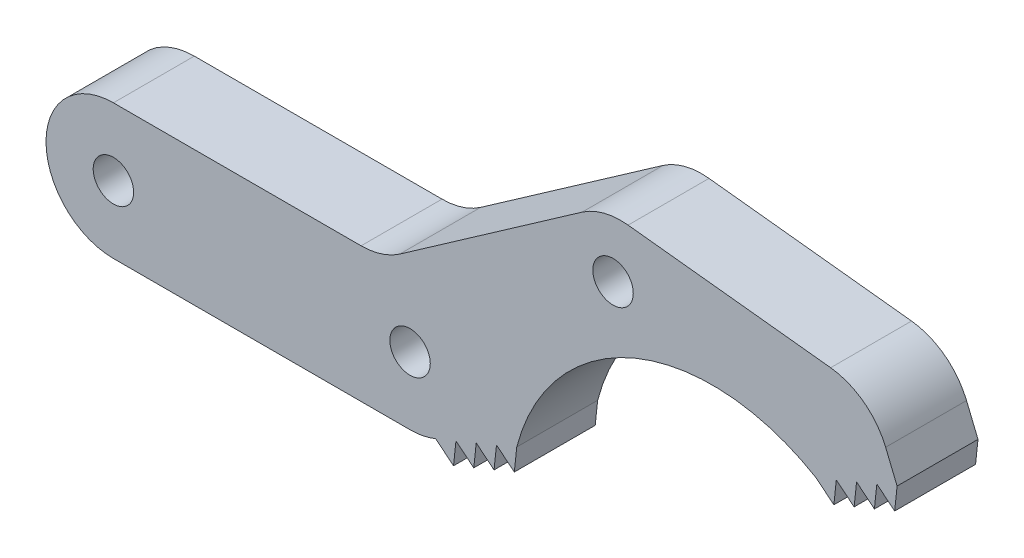
ISO-10303-21;
HEADER;
FILE_DESCRIPTION(('STEP AP214'),'2;1');
FILE_NAME('part.step','',(''),(''),'','','');
FILE_SCHEMA(('AUTOMOTIVE_DESIGN { 1 0 10303 214 1 1 1 1 }'));
ENDSEC;
DATA;
#1=APPLICATION_CONTEXT('core data for automotive mechanical design processes');
#2=APPLICATION_PROTOCOL_DEFINITION('international standard','automotive_design',2000,#1);
#3=PRODUCT_CONTEXT('',#1,'mechanical');
#4=PRODUCT('Part','Part','',(#3));
#5=PRODUCT_RELATED_PRODUCT_CATEGORY('part','',(#4));
#6=PRODUCT_DEFINITION_FORMATION('','',#4);
#7=PRODUCT_DEFINITION_CONTEXT('part definition',#1,'design');
#8=PRODUCT_DEFINITION('design','',#6,#7);
#9=PRODUCT_DEFINITION_SHAPE('','',#8);
#10=(LENGTH_UNIT() NAMED_UNIT(*) SI_UNIT(.MILLI.,.METRE.));
#11=(NAMED_UNIT(*) PLANE_ANGLE_UNIT() SI_UNIT($,.RADIAN.));
#12=(NAMED_UNIT(*) SI_UNIT($,.STERADIAN.) SOLID_ANGLE_UNIT());
#13=UNCERTAINTY_MEASURE_WITH_UNIT(LENGTH_MEASURE(1.E-05),#10,'distance_accuracy_value','');
#14=(GEOMETRIC_REPRESENTATION_CONTEXT(3) GLOBAL_UNCERTAINTY_ASSIGNED_CONTEXT((#13)) GLOBAL_UNIT_ASSIGNED_CONTEXT((#10,
#11,#12)) REPRESENTATION_CONTEXT('',''));
#15=CARTESIAN_POINT('',(0.,0.,0.));
#16=DIRECTION('',(0.,0.,1.));
#17=DIRECTION('',(1.,0.,0.));
#18=AXIS2_PLACEMENT_3D('',#15,#16,#17);
#19=CARTESIAN_POINT('',(29.8032233444276,-3.18132552022446,6.));
#20=DIRECTION('',(-0.994351051543035,0.106141350543794,0.));
#21=DIRECTION('',(-0.106141350543795,-0.994351051543035,0.));
#22=AXIS2_PLACEMENT_3D('',#19,#20,#21);
#23=PLANE('',#22);
#24=DIRECTION('',(0.106141350543795,0.994351051543035,0.));
#25=VECTOR('',#24,1.);
#26=CARTESIAN_POINT('',(29.8032233444276,-3.18132552022446,0.));
#27=LINE('',#26,#25);
#28=CARTESIAN_POINT('',(29.7319571054631,-3.84896032316251,0.));
#29=VERTEX_POINT('',#28);
#30=CARTESIAN_POINT('',(29.9130255467486,-2.15267895806697,0.));
#31=VERTEX_POINT('',#30);
#32=EDGE_CURVE('E249',#29,#31,#27,.T.);
#33=ORIENTED_EDGE('',*,*,#32,.T.);
#34=DIRECTION('',(0.,0.,-1.));
#35=VECTOR('',#34,1.);
#36=CARTESIAN_POINT('',(29.9130255467486,-2.15267895806697,6.));
#37=LINE('',#36,#35);
#38=CARTESIAN_POINT('',(29.9130255467486,-2.15267895806697,6.));
#39=VERTEX_POINT('',#38);
#40=EDGE_CURVE('E229',#39,#31,#37,.T.);
#41=ORIENTED_EDGE('',*,*,#40,.F.);
#42=DIRECTION('',(0.106141350543795,0.994351051543035,0.));
#43=VECTOR('',#42,1.);
#44=CARTESIAN_POINT('',(29.8032233444276,-3.18132552022446,6.));
#45=LINE('',#44,#43);
#46=CARTESIAN_POINT('',(29.7319571054631,-3.84896032316251,6.));
#47=VERTEX_POINT('',#46);
#48=EDGE_CURVE('E235',#47,#39,#45,.T.);
#49=ORIENTED_EDGE('',*,*,#48,.F.);
#50=DIRECTION('',(0.,0.,-1.));
#51=VECTOR('',#50,1.);
#52=CARTESIAN_POINT('',(29.7319571054631,-3.84896032316251,6.));
#53=LINE('',#52,#51);
#54=EDGE_CURVE('E332',#47,#29,#53,.T.);
#55=ORIENTED_EDGE('',*,*,#54,.T.);
#56=EDGE_LOOP('',(#33,#41,#49,#55));
#57=FACE_BOUND('',#56,.T.);
#58=ADVANCED_FACE('F46',(#57),#23,.F.);
#59=CARTESIAN_POINT('',(44.433934999346,-5.91342205876754,6.));
#60=DIRECTION('',(0.,0.,-1.));
#61=DIRECTION('',(-1.,0.,0.));
#62=AXIS2_PLACEMENT_3D('',#59,#60,#61);
#63=CYLINDRICAL_SURFACE('',#62,15.);
#64=CARTESIAN_POINT('',(44.433934999346,-5.91342205876754,0.));
#65=DIRECTION('',(0.,0.,1.));
#66=DIRECTION('',(1.,0.,0.));
#67=AXIS2_PLACEMENT_3D('',#64,#65,#66);
#68=CIRCLE('',#67,15.);
#69=CARTESIAN_POINT('',(52.1101030227458,6.97364294752982,0.));
#70=VERTEX_POINT('',#69);
#71=EDGE_CURVE('E337',#31,#70,#68,.F.);
#72=ORIENTED_EDGE('',*,*,#71,.T.);
#73=DIRECTION('',(0.,0.,-1.));
#74=VECTOR('',#73,1.);
#75=CARTESIAN_POINT('',(52.1101030227458,6.97364294752982,6.));
#76=LINE('',#75,#74);
#77=CARTESIAN_POINT('',(52.1101030227458,6.97364294752982,6.));
#78=VERTEX_POINT('',#77);
#79=EDGE_CURVE('E232',#78,#70,#76,.T.);
#80=ORIENTED_EDGE('',*,*,#79,.F.);
#81=CARTESIAN_POINT('',(44.433934999346,-5.91342205876754,6.));
#82=DIRECTION('',(0.,0.,1.));
#83=DIRECTION('',(1.,0.,0.));
#84=AXIS2_PLACEMENT_3D('',#81,#82,#83);
#85=CIRCLE('',#84,15.);
#86=EDGE_CURVE('E225',#39,#78,#85,.F.);
#87=ORIENTED_EDGE('',*,*,#86,.F.);
#88=ORIENTED_EDGE('',*,*,#40,.T.);
#89=EDGE_LOOP('',(#72,#80,#87,#88));
#90=FACE_BOUND('',#89,.T.);
#91=ADVANCED_FACE('F227',(#90),#63,.F.);
#92=CARTESIAN_POINT('',(24.23803305922,29.7112771820297,6.));
#93=DIRECTION('',(0.632124940560197,0.774866478512116,0.));
#94=DIRECTION('',(-0.774866478512116,0.632124940560197,0.));
#95=AXIS2_PLACEMENT_3D('',#92,#93,#94);
#96=PLANE('',#95);
#97=DIRECTION('',(0.774866478512116,-0.632124940560197,0.));
#98=VECTOR('',#97,1.);
#99=CARTESIAN_POINT('',(24.23803305922,29.7112771820297,0.));
#100=LINE('',#99,#98);
#101=CARTESIAN_POINT('',(53.4319617022309,5.89528962812572,0.));
#102=VERTEX_POINT('',#101);
#103=EDGE_CURVE('E339',#70,#102,#100,.T.);
#104=ORIENTED_EDGE('',*,*,#103,.T.);
#105=DIRECTION('',(0.,0.,-1.));
#106=VECTOR('',#105,1.);
#107=CARTESIAN_POINT('',(53.4319617022309,5.89528962812572,6.));
#108=LINE('',#107,#106);
#109=CARTESIAN_POINT('',(53.4319617022309,5.89528962812572,6.));
#110=VERTEX_POINT('',#109);
#111=EDGE_CURVE('E254',#110,#102,#108,.T.);
#112=ORIENTED_EDGE('',*,*,#111,.F.);
#113=DIRECTION('',(0.774866478512116,-0.632124940560197,0.));
#114=VECTOR('',#113,1.);
#115=CARTESIAN_POINT('',(24.23803305922,29.7112771820297,6.));
#116=LINE('',#115,#114);
#117=EDGE_CURVE('E234',#78,#110,#116,.T.);
#118=ORIENTED_EDGE('',*,*,#117,.F.);
#119=ORIENTED_EDGE('',*,*,#79,.T.);
#120=EDGE_LOOP('',(#104,#112,#118,#119));
#121=FACE_BOUND('',#120,.T.);
#122=ADVANCED_FACE('F517',(#121),#96,.F.);
#123=CARTESIAN_POINT('',(52.2077986901191,-5.5728872145194,6.));
#124=DIRECTION('',(-0.994351051543034,0.1061413505438,0.));
#125=DIRECTION('',(-0.1061413505438,-0.994351051543034,0.));
#126=AXIS2_PLACEMENT_3D('',#123,#124,#125);
#127=PLANE('',#126);
#128=DIRECTION('',(0.1061413505438,0.994351051543034,0.));
#129=VECTOR('',#128,1.);
#130=CARTESIAN_POINT('',(52.2077986901191,-5.5728872145194,0.));
#131=LINE('',#130,#129);
#132=CARTESIAN_POINT('',(53.6130301435165,7.59157099322127,0.));
#133=VERTEX_POINT('',#132);
#134=EDGE_CURVE('E341',#102,#133,#131,.T.);
#135=ORIENTED_EDGE('',*,*,#134,.T.);
#136=DIRECTION('',(0.,0.,-1.));
#137=VECTOR('',#136,1.);
#138=CARTESIAN_POINT('',(53.6130301435165,7.59157099322127,6.));
#139=LINE('',#138,#137);
#140=CARTESIAN_POINT('',(53.6130301435165,7.59157099322127,6.));
#141=VERTEX_POINT('',#140);
#142=EDGE_CURVE('E433',#141,#133,#139,.T.);
#143=ORIENTED_EDGE('',*,*,#142,.F.);
#144=DIRECTION('',(0.1061413505438,0.994351051543034,0.));
#145=VECTOR('',#144,1.);
#146=CARTESIAN_POINT('',(52.2077986901191,-5.5728872145194,6.));
#147=LINE('',#146,#145);
#148=EDGE_CURVE('E442',#110,#141,#147,.T.);
#149=ORIENTED_EDGE('',*,*,#148,.F.);
#150=ORIENTED_EDGE('',*,*,#111,.T.);
#151=EDGE_LOOP('',(#135,#143,#149,#150));
#152=FACE_BOUND('',#151,.T.);
#153=ADVANCED_FACE('F440',(#152),#127,.F.);
#154=CARTESIAN_POINT('',(25.1412444301033,30.818444720283,6.));
#155=DIRECTION('',(0.632124940560195,0.774866478512118,0.));
#156=DIRECTION('',(-0.774866478512118,0.632124940560195,0.));
#157=AXIS2_PLACEMENT_3D('',#154,#155,#156);
#158=PLANE('',#157);
#159=DIRECTION('',(0.774866478512118,-0.632124940560195,0.));
#160=VECTOR('',#159,1.);
#161=CARTESIAN_POINT('',(25.1412444301033,30.818444720283,0.));
#162=LINE('',#161,#160);
#163=CARTESIAN_POINT('',(54.9348888230016,6.51321767381717,0.));
#164=VERTEX_POINT('',#163);
#165=EDGE_CURVE('E343',#133,#164,#162,.T.);
#166=ORIENTED_EDGE('',*,*,#165,.T.);
#167=DIRECTION('',(0.,0.,-1.));
#168=VECTOR('',#167,1.);
#169=CARTESIAN_POINT('',(54.9348888230016,6.51321767381717,6.));
#170=LINE('',#169,#168);
#171=CARTESIAN_POINT('',(54.9348888230016,6.51321767381717,6.));
#172=VERTEX_POINT('',#171);
#173=EDGE_CURVE('E430',#172,#164,#170,.T.);
#174=ORIENTED_EDGE('',*,*,#173,.F.);
#175=DIRECTION('',(0.774866478512118,-0.632124940560195,0.));
#176=VECTOR('',#175,1.);
#177=CARTESIAN_POINT('',(25.1412444301033,30.818444720283,6.));
#178=LINE('',#177,#176);
#179=EDGE_CURVE('E459',#141,#172,#178,.T.);
#180=ORIENTED_EDGE('',*,*,#179,.F.);
#181=ORIENTED_EDGE('',*,*,#142,.T.);
#182=EDGE_LOOP('',(#166,#174,#180,#181));
#183=FACE_BOUND('',#182,.T.);
#184=ADVANCED_FACE('F450',(#183),#158,.F.);
#185=CARTESIAN_POINT('',(53.6285766388703,-5.72454722440151,6.));
#186=DIRECTION('',(-0.994351051543034,0.106141350543801,0.));
#187=DIRECTION('',(-0.106141350543801,-0.994351051543034,0.));
#188=AXIS2_PLACEMENT_3D('',#185,#186,#187);
#189=PLANE('',#188);
#190=DIRECTION('',(0.106141350543801,0.994351051543034,0.));
#191=VECTOR('',#190,1.);
#192=CARTESIAN_POINT('',(53.6285766388703,-5.72454722440151,0.));
#193=LINE('',#192,#191);
#194=CARTESIAN_POINT('',(55.1159572642871,8.20949903891272,0.));
#195=VERTEX_POINT('',#194);
#196=EDGE_CURVE('E345',#164,#195,#193,.T.);
#197=ORIENTED_EDGE('',*,*,#196,.T.);
#198=DIRECTION('',(0.,0.,-1.));
#199=VECTOR('',#198,1.);
#200=CARTESIAN_POINT('',(55.1159572642871,8.20949903891272,6.));
#201=LINE('',#200,#199);
#202=CARTESIAN_POINT('',(55.1159572642871,8.20949903891272,6.));
#203=VERTEX_POINT('',#202);
#204=EDGE_CURVE('E427',#203,#195,#201,.T.);
#205=ORIENTED_EDGE('',*,*,#204,.F.);
#206=DIRECTION('',(0.106141350543801,0.994351051543034,0.));
#207=VECTOR('',#206,1.);
#208=CARTESIAN_POINT('',(53.6285766388703,-5.72454722440151,6.));
#209=LINE('',#208,#207);
#210=EDGE_CURVE('E456',#172,#203,#209,.T.);
#211=ORIENTED_EDGE('',*,*,#210,.F.);
#212=ORIENTED_EDGE('',*,*,#173,.T.);
#213=EDGE_LOOP('',(#197,#205,#211,#212));
#214=FACE_BOUND('',#213,.T.);
#215=ADVANCED_FACE('F454',(#214),#189,.F.);
#216=CARTESIAN_POINT('',(26.0444558009867,31.9256122585363,6.));
#217=DIRECTION('',(0.632124940560194,0.774866478512118,0.));
#218=DIRECTION('',(-0.774866478512118,0.632124940560194,0.));
#219=AXIS2_PLACEMENT_3D('',#216,#217,#218);
#220=PLANE('',#219);
#221=DIRECTION('',(0.774866478512118,-0.632124940560194,0.));
#222=VECTOR('',#221,1.);
#223=CARTESIAN_POINT('',(26.0444558009867,31.9256122585363,0.));
#224=LINE('',#223,#222);
#225=CARTESIAN_POINT('',(56.4378159437722,7.13114571950862,0.));
#226=VERTEX_POINT('',#225);
#227=EDGE_CURVE('E347',#195,#226,#224,.T.);
#228=ORIENTED_EDGE('',*,*,#227,.T.);
#229=DIRECTION('',(0.,0.,-1.));
#230=VECTOR('',#229,1.);
#231=CARTESIAN_POINT('',(56.4378159437722,7.13114571950862,6.));
#232=LINE('',#231,#230);
#233=CARTESIAN_POINT('',(56.4378159437722,7.13114571950862,6.));
#234=VERTEX_POINT('',#233);
#235=EDGE_CURVE('E424',#234,#226,#232,.T.);
#236=ORIENTED_EDGE('',*,*,#235,.F.);
#237=DIRECTION('',(0.774866478512118,-0.632124940560194,0.));
#238=VECTOR('',#237,1.);
#239=CARTESIAN_POINT('',(26.0444558009867,31.9256122585363,6.));
#240=LINE('',#239,#238);
#241=EDGE_CURVE('E458',#203,#234,#240,.T.);
#242=ORIENTED_EDGE('',*,*,#241,.F.);
#243=ORIENTED_EDGE('',*,*,#204,.T.);
#244=EDGE_LOOP('',(#228,#236,#242,#243));
#245=FACE_BOUND('',#244,.T.);
#246=ADVANCED_FACE('F503',(#245),#220,.F.);
#247=CARTESIAN_POINT('',(55.0493545876215,-5.8762072342834,6.));
#248=DIRECTION('',(-0.994351051543035,0.106141350543796,0.));
#249=DIRECTION('',(-0.106141350543796,-0.994351051543035,0.));
#250=AXIS2_PLACEMENT_3D('',#247,#248,#249);
#251=PLANE('',#250);
#252=DIRECTION('',(0.106141350543796,0.994351051543035,0.));
#253=VECTOR('',#252,1.);
#254=CARTESIAN_POINT('',(55.0493545876215,-5.8762072342834,0.));
#255=LINE('',#254,#253);
#256=CARTESIAN_POINT('',(56.6188843850578,8.82742708460417,0.));
#257=VERTEX_POINT('',#256);
#258=EDGE_CURVE('E349',#226,#257,#255,.T.);
#259=ORIENTED_EDGE('',*,*,#258,.T.);
#260=DIRECTION('',(0.,0.,-1.));
#261=VECTOR('',#260,1.);
#262=CARTESIAN_POINT('',(56.6188843850578,8.82742708460417,6.));
#263=LINE('',#262,#261);
#264=CARTESIAN_POINT('',(56.6188843850578,8.82742708460417,6.));
#265=VERTEX_POINT('',#264);
#266=EDGE_CURVE('E421',#265,#257,#263,.T.);
#267=ORIENTED_EDGE('',*,*,#266,.F.);
#268=DIRECTION('',(0.106141350543796,0.994351051543035,0.));
#269=VECTOR('',#268,1.);
#270=CARTESIAN_POINT('',(55.0493545876215,-5.8762072342834,6.));
#271=LINE('',#270,#269);
#272=EDGE_CURVE('E461',#234,#265,#271,.T.);
#273=ORIENTED_EDGE('',*,*,#272,.F.);
#274=ORIENTED_EDGE('',*,*,#235,.T.);
#275=EDGE_LOOP('',(#259,#267,#273,#274));
#276=FACE_BOUND('',#275,.T.);
#277=ADVANCED_FACE('F500',(#276),#251,.F.);
#278=CARTESIAN_POINT('',(26.9476671718701,33.0327797967896,6.));
#279=DIRECTION('',(0.632124940560194,0.774866478512118,0.));
#280=DIRECTION('',(-0.774866478512118,0.632124940560194,0.));
#281=AXIS2_PLACEMENT_3D('',#278,#279,#280);
#282=PLANE('',#281);
#283=DIRECTION('',(0.774866478512118,-0.632124940560194,0.));
#284=VECTOR('',#283,1.);
#285=CARTESIAN_POINT('',(26.9476671718701,33.0327797967896,0.));
#286=LINE('',#285,#284);
#287=CARTESIAN_POINT('',(57.9407430645429,7.74907376520007,0.));
#288=VERTEX_POINT('',#287);
#289=EDGE_CURVE('E351',#257,#288,#286,.T.);
#290=ORIENTED_EDGE('',*,*,#289,.T.);
#291=DIRECTION('',(0.,0.,-1.));
#292=VECTOR('',#291,1.);
#293=CARTESIAN_POINT('',(57.9407430645429,7.74907376520007,6.));
#294=LINE('',#293,#292);
#295=CARTESIAN_POINT('',(57.9407430645429,7.74907376520007,6.));
#296=VERTEX_POINT('',#295);
#297=EDGE_CURVE('E418',#296,#288,#294,.T.);
#298=ORIENTED_EDGE('',*,*,#297,.F.);
#299=DIRECTION('',(0.774866478512118,-0.632124940560194,0.));
#300=VECTOR('',#299,1.);
#301=CARTESIAN_POINT('',(26.9476671718701,33.0327797967896,6.));
#302=LINE('',#301,#300);
#303=EDGE_CURVE('E467',#265,#296,#302,.T.);
#304=ORIENTED_EDGE('',*,*,#303,.F.);
#305=ORIENTED_EDGE('',*,*,#266,.T.);
#306=EDGE_LOOP('',(#290,#298,#304,#305));
#307=FACE_BOUND('',#306,.T.);
#308=ADVANCED_FACE('F495',(#307),#282,.F.);
#309=CARTESIAN_POINT('',(56.4701325363727,-6.02786724416553,6.));
#310=DIRECTION('',(-0.994351051543035,0.106141350543797,0.));
#311=DIRECTION('',(-0.106141350543797,-0.994351051543035,0.));
#312=AXIS2_PLACEMENT_3D('',#309,#310,#311);
#313=PLANE('',#312);
#314=DIRECTION('',(0.106141350543797,0.994351051543035,0.));
#315=VECTOR('',#314,1.);
#316=CARTESIAN_POINT('',(56.4701325363727,-6.02786724416553,0.));
#317=LINE('',#316,#315);
#318=CARTESIAN_POINT('',(58.1218115058284,9.44535513029561,0.));
#319=VERTEX_POINT('',#318);
#320=EDGE_CURVE('E353',#288,#319,#317,.T.);
#321=ORIENTED_EDGE('',*,*,#320,.T.);
#322=DIRECTION('',(0.,0.,-1.));
#323=VECTOR('',#322,1.);
#324=CARTESIAN_POINT('',(58.1218115058284,9.44535513029561,6.));
#325=LINE('',#324,#323);
#326=CARTESIAN_POINT('',(58.1218115058284,9.44535513029561,6.));
#327=VERTEX_POINT('',#326);
#328=EDGE_CURVE('E415',#327,#319,#325,.T.);
#329=ORIENTED_EDGE('',*,*,#328,.F.);
#330=DIRECTION('',(0.106141350543797,0.994351051543035,0.));
#331=VECTOR('',#330,1.);
#332=CARTESIAN_POINT('',(56.4701325363727,-6.02786724416553,6.));
#333=LINE('',#332,#331);
#334=EDGE_CURVE('E469',#296,#327,#333,.T.);
#335=ORIENTED_EDGE('',*,*,#334,.F.);
#336=ORIENTED_EDGE('',*,*,#297,.T.);
#337=EDGE_LOOP('',(#321,#329,#335,#336));
#338=FACE_BOUND('',#337,.T.);
#339=ADVANCED_FACE('F490',(#338),#313,.F.);
#340=CARTESIAN_POINT('',(53.0392886547655,21.8070880020437,6.));
#341=DIRECTION('',(-0.924878228166553,-0.380263412733198,0.));
#342=DIRECTION('',(0.380263412733198,-0.924878228166553,0.));
#343=AXIS2_PLACEMENT_3D('',#340,#341,#342);
#344=PLANE('',#343);
#345=DIRECTION('',(-0.380263412733198,0.924878228166553,0.));
#346=VECTOR('',#345,1.);
#347=CARTESIAN_POINT('',(53.0392886547655,21.8070880020437,0.));
#348=LINE('',#347,#346);
#349=CARTESIAN_POINT('',(57.2717814951054,11.5128015999815,0.));
#350=VERTEX_POINT('',#349);
#351=EDGE_CURVE('E355',#319,#350,#348,.T.);
#352=ORIENTED_EDGE('',*,*,#351,.T.);
#353=DIRECTION('',(0.,0.,-1.));
#354=VECTOR('',#353,1.);
#355=CARTESIAN_POINT('',(57.2717814951054,11.5128015999815,6.));
#356=LINE('',#355,#354);
#357=CARTESIAN_POINT('',(57.2717814951054,11.5128015999815,6.));
#358=VERTEX_POINT('',#357);
#359=EDGE_CURVE('E264',#350,#358,#356,.F.);
#360=ORIENTED_EDGE('',*,*,#359,.T.);
#361=DIRECTION('',(-0.380263412733198,0.924878228166553,0.));
#362=VECTOR('',#361,1.);
#363=CARTESIAN_POINT('',(53.0392886547655,21.8070880020437,6.));
#364=LINE('',#363,#362);
#365=EDGE_CURVE('E471',#327,#358,#364,.T.);
#366=ORIENTED_EDGE('',*,*,#365,.F.);
#367=ORIENTED_EDGE('',*,*,#328,.T.);
#368=EDGE_LOOP('',(#352,#360,#366,#367));
#369=FACE_BOUND('',#368,.T.);
#370=ADVANCED_FACE('F485',(#369),#344,.F.);
#371=CARTESIAN_POINT('',(2.21681401583949,20.181146044812,6.));
#372=DIRECTION('',(0.109189026672776,0.994021004030726,0.));
#373=DIRECTION('',(-0.994021004030726,0.109189026672776,0.));
#374=AXIS2_PLACEMENT_3D('',#371,#372,#373);
#375=PLANE('',#374);
#376=DIRECTION('',(0.994021004030726,-0.109189026672776,0.));
#377=VECTOR('',#376,1.);
#378=CARTESIAN_POINT('',(2.21681401583949,20.181146044812,6.));
#379=LINE('',#378,#377);
#380=CARTESIAN_POINT('',(38.1721572643866,16.2316028087285,6.));
#381=VERTEX_POINT('',#380);
#382=CARTESIAN_POINT('',(53.1933354876365,14.5815895564691,6.));
#383=VERTEX_POINT('',#382);
#384=EDGE_CURVE('E305',#381,#383,#379,.T.);
#385=ORIENTED_EDGE('',*,*,#384,.T.);
#386=DIRECTION('',(0.,0.,-1.));
#387=VECTOR('',#386,1.);
#388=CARTESIAN_POINT('',(53.1933354876365,14.5815895564691,0.));
#389=LINE('',#388,#387);
#390=CARTESIAN_POINT('',(53.1933354876365,14.5815895564691,0.));
#391=VERTEX_POINT('',#390);
#392=EDGE_CURVE('E252',#383,#391,#389,.T.);
#393=ORIENTED_EDGE('',*,*,#392,.T.);
#394=DIRECTION('',(0.994021004030726,-0.109189026672776,0.));
#395=VECTOR('',#394,1.);
#396=CARTESIAN_POINT('',(2.21681401583949,20.181146044812,0.));
#397=LINE('',#396,#395);
#398=CARTESIAN_POINT('',(38.1721572643866,16.2316028087285,0.));
#399=VERTEX_POINT('',#398);
#400=EDGE_CURVE('E293',#399,#391,#397,.T.);
#401=ORIENTED_EDGE('',*,*,#400,.F.);
#402=DIRECTION('',(0.,0.,-1.));
#403=VECTOR('',#402,1.);
#404=CARTESIAN_POINT('',(38.1721572643866,16.2316028087285,6.));
#405=LINE('',#404,#403);
#406=EDGE_CURVE('E250',#399,#381,#405,.F.);
#407=ORIENTED_EDGE('',*,*,#406,.T.);
#408=EDGE_LOOP('',(#385,#393,#401,#407));
#409=FACE_BOUND('',#408,.T.);
#410=ADVANCED_FACE('F475',(#409),#375,.T.);
#411=CARTESIAN_POINT('',(4.20013769356793,-6.00749350269535,6.));
#412=DIRECTION('',(-0.572994590021421,0.819559149669006,0.));
#413=DIRECTION('',(-0.819559149669006,-0.572994590021421,0.));
#414=AXIS2_PLACEMENT_3D('',#411,#412,#413);
#415=PLANE('',#414);
#416=DIRECTION('',(0.819559149669006,0.572994590021421,0.));
#417=VECTOR('',#416,1.);
#418=CARTESIAN_POINT('',(4.20013769356793,-6.00749350269535,6.));
#419=LINE('',#418,#417);
#420=CARTESIAN_POINT('',(21.2346820581235,5.90220425165497,6.));
#421=VERTEX_POINT('',#420);
#422=CARTESIAN_POINT('',(34.7612391809157,15.3592935369199,6.));
#423=VERTEX_POINT('',#422);
#424=EDGE_CURVE('E302',#421,#423,#419,.T.);
#425=ORIENTED_EDGE('',*,*,#424,.T.);
#426=DIRECTION('',(0.,0.,-1.));
#427=VECTOR('',#426,1.);
#428=CARTESIAN_POINT('',(34.7612391809157,15.3592935369199,6.));
#429=LINE('',#428,#427);
#430=CARTESIAN_POINT('',(34.7612391809157,15.3592935369199,0.));
#431=VERTEX_POINT('',#430);
#432=EDGE_CURVE('E271',#423,#431,#429,.T.);
#433=ORIENTED_EDGE('',*,*,#432,.T.);
#434=DIRECTION('',(0.819559149669006,0.572994590021421,0.));
#435=VECTOR('',#434,1.);
#436=CARTESIAN_POINT('',(4.20013769356793,-6.00749350269535,0.));
#437=LINE('',#436,#435);
#438=CARTESIAN_POINT('',(21.2346820581235,5.90220425165497,0.));
#439=VERTEX_POINT('',#438);
#440=EDGE_CURVE('E283',#439,#431,#437,.T.);
#441=ORIENTED_EDGE('',*,*,#440,.F.);
#442=DIRECTION('',(0.,0.,-1.));
#443=VECTOR('',#442,1.);
#444=CARTESIAN_POINT('',(21.2346820581235,5.90220425165498,6.));
#445=LINE('',#444,#443);
#446=EDGE_CURVE('E269',#439,#421,#445,.F.);
#447=ORIENTED_EDGE('',*,*,#446,.T.);
#448=EDGE_LOOP('',(#425,#433,#441,#447));
#449=FACE_BOUND('',#448,.T.);
#450=ADVANCED_FACE('F291',(#449),#415,.T.);
#451=CARTESIAN_POINT('',(0.,5.,6.));
#452=DIRECTION('',(0.,1.,0.));
#453=DIRECTION('',(0.,0.,1.));
#454=AXIS2_PLACEMENT_3D('',#451,#452,#453);
#455=PLANE('',#454);
#456=DIRECTION('',(1.,0.,0.));
#457=VECTOR('',#456,1.);
#458=CARTESIAN_POINT('',(0.,5.,6.));
#459=LINE('',#458,#457);
#460=CARTESIAN_POINT('',(0.,5.,6.));
#461=VERTEX_POINT('',#460);
#462=CARTESIAN_POINT('',(18.3697091080164,5.,6.));
#463=VERTEX_POINT('',#462);
#464=EDGE_CURVE('E297',#461,#463,#459,.T.);
#465=ORIENTED_EDGE('',*,*,#464,.T.);
#466=DIRECTION('',(0.,0.,-1.));
#467=VECTOR('',#466,1.);
#468=CARTESIAN_POINT('',(18.3697091080164,5.,0.));
#469=LINE('',#468,#467);
#470=CARTESIAN_POINT('',(18.3697091080164,5.,0.));
#471=VERTEX_POINT('',#470);
#472=EDGE_CURVE('E274',#463,#471,#469,.T.);
#473=ORIENTED_EDGE('',*,*,#472,.T.);
#474=DIRECTION('',(1.,0.,0.));
#475=VECTOR('',#474,1.);
#476=CARTESIAN_POINT('',(0.,5.,0.));
#477=LINE('',#476,#475);
#478=CARTESIAN_POINT('',(0.,5.,0.));
#479=VERTEX_POINT('',#478);
#480=EDGE_CURVE('E286',#479,#471,#477,.T.);
#481=ORIENTED_EDGE('',*,*,#480,.F.);
#482=DIRECTION('',(0.,0.,-1.));
#483=VECTOR('',#482,1.);
#484=CARTESIAN_POINT('',(0.,5.,6.));
#485=LINE('',#484,#483);
#486=EDGE_CURVE('E298',#461,#479,#485,.T.);
#487=ORIENTED_EDGE('',*,*,#486,.F.);
#488=EDGE_LOOP('',(#465,#473,#481,#487));
#489=FACE_BOUND('',#488,.T.);
#490=ADVANCED_FACE('F296',(#489),#455,.T.);
#491=CARTESIAN_POINT('',(0.,0.,6.));
#492=DIRECTION('',(0.,0.,-1.));
#493=DIRECTION('',(-1.,0.,0.));
#494=AXIS2_PLACEMENT_3D('',#491,#492,#493);
#495=CYLINDRICAL_SURFACE('',#494,5.);
#496=CARTESIAN_POINT('',(0.,0.,0.));
#497=DIRECTION('',(0.,0.,1.));
#498=DIRECTION('',(1.,0.,0.));
#499=AXIS2_PLACEMENT_3D('',#496,#497,#498);
#500=CIRCLE('',#499,5.);
#501=CARTESIAN_POINT('',(0.,-5.,0.));
#502=VERTEX_POINT('',#501);
#503=EDGE_CURVE('E360',#479,#502,#500,.T.);
#504=ORIENTED_EDGE('',*,*,#503,.T.);
#505=DIRECTION('',(0.,0.,-1.));
#506=VECTOR('',#505,1.);
#507=CARTESIAN_POINT('',(0.,-5.,6.));
#508=LINE('',#507,#506);
#509=CARTESIAN_POINT('',(0.,-5.,6.));
#510=VERTEX_POINT('',#509);
#511=EDGE_CURVE('E411',#510,#502,#508,.T.);
#512=ORIENTED_EDGE('',*,*,#511,.F.);
#513=CARTESIAN_POINT('',(0.,0.,6.));
#514=DIRECTION('',(0.,0.,1.));
#515=DIRECTION('',(1.,0.,0.));
#516=AXIS2_PLACEMENT_3D('',#513,#514,#515);
#517=CIRCLE('',#516,5.);
#518=EDGE_CURVE('E301',#461,#510,#517,.T.);
#519=ORIENTED_EDGE('',*,*,#518,.F.);
#520=ORIENTED_EDGE('',*,*,#486,.T.);
#521=EDGE_LOOP('',(#504,#512,#519,#520));
#522=FACE_BOUND('',#521,.T.);
#523=ADVANCED_FACE('F577',(#522),#495,.T.);
#524=CARTESIAN_POINT('',(0.,-5.,6.));
#525=DIRECTION('',(0.,1.,0.));
#526=DIRECTION('',(0.,0.,1.));
#527=AXIS2_PLACEMENT_3D('',#524,#525,#526);
#528=PLANE('',#527);
#529=DIRECTION('',(1.,0.,0.));
#530=VECTOR('',#529,1.);
#531=CARTESIAN_POINT('',(0.,-5.,0.));
#532=LINE('',#531,#530);
#533=CARTESIAN_POINT('',(22.,-5.,0.));
#534=VERTEX_POINT('',#533);
#535=EDGE_CURVE('E362',#502,#534,#532,.T.);
#536=ORIENTED_EDGE('',*,*,#535,.T.);
#537=DIRECTION('',(0.,0.,-1.));
#538=VECTOR('',#537,1.);
#539=CARTESIAN_POINT('',(22.,-5.,6.));
#540=LINE('',#539,#538);
#541=CARTESIAN_POINT('',(22.,-5.,6.));
#542=VERTEX_POINT('',#541);
#543=EDGE_CURVE('E408',#542,#534,#540,.T.);
#544=ORIENTED_EDGE('',*,*,#543,.F.);
#545=DIRECTION('',(1.,0.,0.));
#546=VECTOR('',#545,1.);
#547=CARTESIAN_POINT('',(0.,-5.,6.));
#548=LINE('',#547,#546);
#549=EDGE_CURVE('E303',#510,#542,#548,.T.);
#550=ORIENTED_EDGE('',*,*,#549,.F.);
#551=ORIENTED_EDGE('',*,*,#511,.T.);
#552=EDGE_LOOP('',(#536,#544,#550,#551));
#553=FACE_BOUND('',#552,.T.);
#554=ADVANCED_FACE('F707',(#553),#528,.F.);
#555=CARTESIAN_POINT('',(22.,0.,6.));
#556=DIRECTION('',(0.,0.,-1.));
#557=DIRECTION('',(-1.,0.,0.));
#558=AXIS2_PLACEMENT_3D('',#555,#556,#557);
#559=CYLINDRICAL_SURFACE('',#558,5.);
#560=CARTESIAN_POINT('',(22.,0.,0.));
#561=DIRECTION('',(0.,0.,1.));
#562=DIRECTION('',(1.,0.,0.));
#563=AXIS2_PLACEMENT_3D('',#560,#561,#562);
#564=CIRCLE('',#563,5.);
#565=CARTESIAN_POINT('',(23.901317063666,-4.62439114083276,0.));
#566=VERTEX_POINT('',#565);
#567=EDGE_CURVE('E364',#534,#566,#564,.T.);
#568=ORIENTED_EDGE('',*,*,#567,.T.);
#569=DIRECTION('',(0.,0.,-1.));
#570=VECTOR('',#569,1.);
#571=CARTESIAN_POINT('',(23.901317063666,-4.62439114083276,6.));
#572=LINE('',#571,#570);
#573=CARTESIAN_POINT('',(23.901317063666,-4.62439114083276,6.));
#574=VERTEX_POINT('',#573);
#575=EDGE_CURVE('E405',#574,#566,#572,.T.);
#576=ORIENTED_EDGE('',*,*,#575,.F.);
#577=CARTESIAN_POINT('',(22.,0.,6.));
#578=DIRECTION('',(0.,0.,1.));
#579=DIRECTION('',(1.,0.,0.));
#580=AXIS2_PLACEMENT_3D('',#577,#578,#579);
#581=CIRCLE('',#580,5.);
#582=EDGE_CURVE('E311',#542,#574,#581,.T.);
#583=ORIENTED_EDGE('',*,*,#582,.F.);
#584=ORIENTED_EDGE('',*,*,#543,.T.);
#585=EDGE_LOOP('',(#568,#576,#583,#584));
#586=FACE_BOUND('',#585,.T.);
#587=ADVANCED_FACE('F697',(#586),#559,.T.);
#588=CARTESIAN_POINT('',(7.28545040571536,8.93059415635215,6.));
#589=DIRECTION('',(0.632124940560196,0.774866478512117,0.));
#590=DIRECTION('',(-0.774866478512117,0.632124940560196,0.));
#591=AXIS2_PLACEMENT_3D('',#588,#589,#590);
#592=PLANE('',#591);
#593=DIRECTION('',(0.774866478512117,-0.632124940560196,0.));
#594=VECTOR('',#593,1.);
#595=CARTESIAN_POINT('',(7.28545040571536,8.93059415635215,0.));
#596=LINE('',#595,#594);
#597=CARTESIAN_POINT('',(25.2231757431511,-5.70274446023686,0.));
#598=VERTEX_POINT('',#597);
#599=EDGE_CURVE('E366',#566,#598,#596,.T.);
#600=ORIENTED_EDGE('',*,*,#599,.T.);
#601=DIRECTION('',(0.,0.,-1.));
#602=VECTOR('',#601,1.);
#603=CARTESIAN_POINT('',(25.2231757431511,-5.70274446023686,6.));
#604=LINE('',#603,#602);
#605=CARTESIAN_POINT('',(25.2231757431511,-5.70274446023686,6.));
#606=VERTEX_POINT('',#605);
#607=EDGE_CURVE('E402',#606,#598,#604,.T.);
#608=ORIENTED_EDGE('',*,*,#607,.F.);
#609=DIRECTION('',(0.774866478512117,-0.632124940560196,0.));
#610=VECTOR('',#609,1.);
#611=CARTESIAN_POINT('',(7.28545040571536,8.93059415635215,6.));
#612=LINE('',#611,#610);
#613=EDGE_CURVE('E313',#574,#606,#612,.T.);
#614=ORIENTED_EDGE('',*,*,#613,.F.);
#615=ORIENTED_EDGE('',*,*,#575,.T.);
#616=EDGE_LOOP('',(#600,#608,#614,#615));
#617=FACE_BOUND('',#616,.T.);
#618=ADVANCED_FACE('F687',(#617),#592,.F.);
#619=CARTESIAN_POINT('',(25.540889498174,-2.72634549057827,6.));
#620=DIRECTION('',(-0.994351051543034,0.106141350543798,0.));
#621=DIRECTION('',(-0.106141350543798,-0.994351051543034,0.));
#622=AXIS2_PLACEMENT_3D('',#619,#620,#621);
#623=PLANE('',#622);
#624=DIRECTION('',(0.106141350543798,0.994351051543034,0.));
#625=VECTOR('',#624,1.);
#626=CARTESIAN_POINT('',(25.540889498174,-2.72634549057827,0.));
#627=LINE('',#626,#625);
#628=CARTESIAN_POINT('',(25.4042441844366,-4.00646309514131,0.));
#629=VERTEX_POINT('',#628);
#630=EDGE_CURVE('E368',#598,#629,#627,.T.);
#631=ORIENTED_EDGE('',*,*,#630,.T.);
#632=DIRECTION('',(0.,0.,-1.));
#633=VECTOR('',#632,1.);
#634=CARTESIAN_POINT('',(25.4042441844366,-4.00646309514131,6.));
#635=LINE('',#634,#633);
#636=CARTESIAN_POINT('',(25.4042441844366,-4.00646309514131,6.));
#637=VERTEX_POINT('',#636);
#638=EDGE_CURVE('E399',#637,#629,#635,.T.);
#639=ORIENTED_EDGE('',*,*,#638,.F.);
#640=DIRECTION('',(0.106141350543798,0.994351051543034,0.));
#641=VECTOR('',#640,1.);
#642=CARTESIAN_POINT('',(25.540889498174,-2.72634549057827,6.));
#643=LINE('',#642,#641);
#644=EDGE_CURVE('E315',#606,#637,#643,.T.);
#645=ORIENTED_EDGE('',*,*,#644,.F.);
#646=ORIENTED_EDGE('',*,*,#607,.T.);
#647=EDGE_LOOP('',(#631,#639,#645,#646));
#648=FACE_BOUND('',#647,.T.);
#649=ADVANCED_FACE('F677',(#648),#623,.F.);
#650=CARTESIAN_POINT('',(8.18866177659879,10.0377616946055,6.));
#651=DIRECTION('',(0.632124940560196,0.774866478512117,0.));
#652=DIRECTION('',(-0.774866478512117,0.632124940560196,0.));
#653=AXIS2_PLACEMENT_3D('',#650,#651,#652);
#654=PLANE('',#653);
#655=DIRECTION('',(0.774866478512117,-0.632124940560196,0.));
#656=VECTOR('',#655,1.);
#657=CARTESIAN_POINT('',(8.18866177659879,10.0377616946055,0.));
#658=LINE('',#657,#656);
#659=CARTESIAN_POINT('',(26.7261028639218,-5.08481641454541,0.));
#660=VERTEX_POINT('',#659);
#661=EDGE_CURVE('E370',#629,#660,#658,.T.);
#662=ORIENTED_EDGE('',*,*,#661,.T.);
#663=DIRECTION('',(0.,0.,-1.));
#664=VECTOR('',#663,1.);
#665=CARTESIAN_POINT('',(26.7261028639218,-5.08481641454541,6.));
#666=LINE('',#665,#664);
#667=CARTESIAN_POINT('',(26.7261028639218,-5.08481641454541,6.));
#668=VERTEX_POINT('',#667);
#669=EDGE_CURVE('E396',#668,#660,#666,.T.);
#670=ORIENTED_EDGE('',*,*,#669,.F.);
#671=DIRECTION('',(0.774866478512117,-0.632124940560196,0.));
#672=VECTOR('',#671,1.);
#673=CARTESIAN_POINT('',(8.18866177659879,10.0377616946055,6.));
#674=LINE('',#673,#672);
#675=EDGE_CURVE('E317',#637,#668,#674,.T.);
#676=ORIENTED_EDGE('',*,*,#675,.F.);
#677=ORIENTED_EDGE('',*,*,#638,.T.);
#678=EDGE_LOOP('',(#662,#670,#676,#677));
#679=FACE_BOUND('',#678,.T.);
#680=ADVANCED_FACE('F667',(#679),#654,.F.);
#681=CARTESIAN_POINT('',(26.9616674469252,-2.87800550046043,6.));
#682=DIRECTION('',(-0.994351051543034,0.1061413505438,0.));
#683=DIRECTION('',(-0.1061413505438,-0.994351051543034,0.));
#684=AXIS2_PLACEMENT_3D('',#681,#682,#683);
#685=PLANE('',#684);
#686=DIRECTION('',(0.1061413505438,0.994351051543034,0.));
#687=VECTOR('',#686,1.);
#688=CARTESIAN_POINT('',(26.9616674469252,-2.87800550046043,0.));
#689=LINE('',#688,#687);
#690=CARTESIAN_POINT('',(26.9071713052073,-3.38853504944986,0.));
#691=VERTEX_POINT('',#690);
#692=EDGE_CURVE('E372',#660,#691,#689,.T.);
#693=ORIENTED_EDGE('',*,*,#692,.T.);
#694=DIRECTION('',(0.,0.,-1.));
#695=VECTOR('',#694,1.);
#696=CARTESIAN_POINT('',(26.9071713052073,-3.38853504944986,6.));
#697=LINE('',#696,#695);
#698=CARTESIAN_POINT('',(26.9071713052073,-3.38853504944986,6.));
#699=VERTEX_POINT('',#698);
#700=EDGE_CURVE('E393',#699,#691,#697,.T.);
#701=ORIENTED_EDGE('',*,*,#700,.F.);
#702=DIRECTION('',(0.1061413505438,0.994351051543034,0.));
#703=VECTOR('',#702,1.);
#704=CARTESIAN_POINT('',(26.9616674469252,-2.87800550046043,6.));
#705=LINE('',#704,#703);
#706=EDGE_CURVE('E319',#668,#699,#705,.T.);
#707=ORIENTED_EDGE('',*,*,#706,.F.);
#708=ORIENTED_EDGE('',*,*,#669,.T.);
#709=EDGE_LOOP('',(#693,#701,#707,#708));
#710=FACE_BOUND('',#709,.T.);
#711=ADVANCED_FACE('F657',(#710),#685,.F.);
#712=CARTESIAN_POINT('',(9.09187314748223,11.1449292328588,6.));
#713=DIRECTION('',(0.632124940560196,0.774866478512117,0.));
#714=DIRECTION('',(-0.774866478512117,0.632124940560196,0.));
#715=AXIS2_PLACEMENT_3D('',#712,#713,#714);
#716=PLANE('',#715);
#717=DIRECTION('',(0.774866478512117,-0.632124940560196,0.));
#718=VECTOR('',#717,1.);
#719=CARTESIAN_POINT('',(9.09187314748223,11.1449292328588,0.));
#720=LINE('',#719,#718);
#721=CARTESIAN_POINT('',(28.2290299846924,-4.46688836885396,0.));
#722=VERTEX_POINT('',#721);
#723=EDGE_CURVE('E374',#691,#722,#720,.T.);
#724=ORIENTED_EDGE('',*,*,#723,.T.);
#725=DIRECTION('',(0.,0.,-1.));
#726=VECTOR('',#725,1.);
#727=CARTESIAN_POINT('',(28.2290299846924,-4.46688836885396,6.));
#728=LINE('',#727,#726);
#729=CARTESIAN_POINT('',(28.2290299846924,-4.46688836885396,6.));
#730=VERTEX_POINT('',#729);
#731=EDGE_CURVE('E390',#730,#722,#728,.T.);
#732=ORIENTED_EDGE('',*,*,#731,.F.);
#733=DIRECTION('',(0.774866478512117,-0.632124940560196,0.));
#734=VECTOR('',#733,1.);
#735=CARTESIAN_POINT('',(9.09187314748223,11.1449292328588,6.));
#736=LINE('',#735,#734);
#737=EDGE_CURVE('E321',#699,#730,#736,.T.);
#738=ORIENTED_EDGE('',*,*,#737,.F.);
#739=ORIENTED_EDGE('',*,*,#700,.T.);
#740=EDGE_LOOP('',(#724,#732,#738,#739));
#741=FACE_BOUND('',#740,.T.);
#742=ADVANCED_FACE('F647',(#741),#716,.F.);
#743=CARTESIAN_POINT('',(28.3824453956764,-3.02966551034253,6.));
#744=DIRECTION('',(-0.994351051543034,0.1061413505438,0.));
#745=DIRECTION('',(-0.1061413505438,-0.994351051543034,0.));
#746=AXIS2_PLACEMENT_3D('',#743,#744,#745);
#747=PLANE('',#746);
#748=DIRECTION('',(0.1061413505438,0.994351051543034,0.));
#749=VECTOR('',#748,1.);
#750=CARTESIAN_POINT('',(28.3824453956764,-3.02966551034253,0.));
#751=LINE('',#750,#749);
#752=CARTESIAN_POINT('',(28.4100984259779,-2.77060700375841,0.));
#753=VERTEX_POINT('',#752);
#754=EDGE_CURVE('E376',#722,#753,#751,.T.);
#755=ORIENTED_EDGE('',*,*,#754,.T.);
#756=DIRECTION('',(0.,0.,-1.));
#757=VECTOR('',#756,1.);
#758=CARTESIAN_POINT('',(28.4100984259779,-2.77060700375841,6.));
#759=LINE('',#758,#757);
#760=CARTESIAN_POINT('',(28.4100984259779,-2.77060700375841,6.));
#761=VERTEX_POINT('',#760);
#762=EDGE_CURVE('E387',#761,#753,#759,.T.);
#763=ORIENTED_EDGE('',*,*,#762,.F.);
#764=DIRECTION('',(0.1061413505438,0.994351051543034,0.));
#765=VECTOR('',#764,1.);
#766=CARTESIAN_POINT('',(28.3824453956764,-3.02966551034253,6.));
#767=LINE('',#766,#765);
#768=EDGE_CURVE('E323',#730,#761,#767,.T.);
#769=ORIENTED_EDGE('',*,*,#768,.F.);
#770=ORIENTED_EDGE('',*,*,#731,.T.);
#771=EDGE_LOOP('',(#755,#763,#769,#770));
#772=FACE_BOUND('',#771,.T.);
#773=ADVANCED_FACE('F638',(#772),#747,.F.);
#774=CARTESIAN_POINT('',(22.,0.,6.));
#775=DIRECTION('',(0.,0.,-1.));
#776=DIRECTION('',(-1.,0.,0.));
#777=AXIS2_PLACEMENT_3D('',#774,#775,#776);
#778=CYLINDRICAL_SURFACE('',#777,1.5);
#779=CARTESIAN_POINT('',(22.,0.,6.));
#780=DIRECTION('',(0.,0.,1.));
#781=DIRECTION('',(1.,0.,0.));
#782=AXIS2_PLACEMENT_3D('',#779,#780,#781);
#783=CIRCLE('',#782,1.5);
#784=CARTESIAN_POINT('',(23.5,0.,6.));
#785=VERTEX_POINT('',#784);
#786=EDGE_CURVE('E326',#785,#785,#783,.T.);
#787=ORIENTED_EDGE('',*,*,#786,.T.);
#788=EDGE_LOOP('',(#787));
#789=FACE_BOUND('',#788,.T.);
#790=CARTESIAN_POINT('',(22.,0.,0.));
#791=DIRECTION('',(0.,0.,1.));
#792=DIRECTION('',(1.,0.,0.));
#793=AXIS2_PLACEMENT_3D('',#790,#791,#792);
#794=CIRCLE('',#793,1.5);
#795=CARTESIAN_POINT('',(23.5,0.,0.));
#796=VERTEX_POINT('',#795);
#797=EDGE_CURVE('E380',#796,#796,#794,.T.);
#798=ORIENTED_EDGE('',*,*,#797,.F.);
#799=EDGE_LOOP('',(#798));
#800=FACE_BOUND('',#799,.T.);
#801=ADVANCED_FACE('F628',(#789,#800),#778,.F.);
#802=CARTESIAN_POINT('',(9.99508451836567,12.2520967711121,6.));
#803=DIRECTION('',(0.632124940560196,0.774866478512117,0.));
#804=DIRECTION('',(-0.774866478512117,0.632124940560196,0.));
#805=AXIS2_PLACEMENT_3D('',#802,#803,#804);
#806=PLANE('',#805);
#807=DIRECTION('',(0.774866478512117,-0.632124940560196,0.));
#808=VECTOR('',#807,1.);
#809=CARTESIAN_POINT('',(9.99508451836567,12.2520967711121,0.));
#810=LINE('',#809,#808);
#811=EDGE_CURVE('E378',#753,#29,#810,.T.);
#812=ORIENTED_EDGE('',*,*,#811,.T.);
#813=ORIENTED_EDGE('',*,*,#54,.F.);
#814=DIRECTION('',(0.774866478512117,-0.632124940560196,0.));
#815=VECTOR('',#814,1.);
#816=CARTESIAN_POINT('',(9.99508451836567,12.2520967711121,6.));
#817=LINE('',#816,#815);
#818=EDGE_CURVE('E242',#761,#47,#817,.T.);
#819=ORIENTED_EDGE('',*,*,#818,.F.);
#820=ORIENTED_EDGE('',*,*,#762,.T.);
#821=EDGE_LOOP('',(#812,#813,#819,#820));
#822=FACE_BOUND('',#821,.T.);
#823=ADVANCED_FACE('F525',(#822),#806,.F.);
#824=CARTESIAN_POINT('',(37.054498684936,12.0348731355642,6.));
#825=DIRECTION('',(0.,0.,-1.));
#826=DIRECTION('',(-1.,0.,0.));
#827=AXIS2_PLACEMENT_3D('',#824,#825,#826);
#828=CYLINDRICAL_SURFACE('',#827,1.5);
#829=CARTESIAN_POINT('',(37.054498684936,12.0348731355642,6.));
#830=DIRECTION('',(0.,0.,1.));
#831=DIRECTION('',(1.,0.,0.));
#832=AXIS2_PLACEMENT_3D('',#829,#830,#831);
#833=CIRCLE('',#832,1.5);
#834=CARTESIAN_POINT('',(38.554498684936,12.0348731355642,6.));
#835=VERTEX_POINT('',#834);
#836=EDGE_CURVE('E246',#835,#835,#833,.T.);
#837=ORIENTED_EDGE('',*,*,#836,.T.);
#838=EDGE_LOOP('',(#837));
#839=FACE_BOUND('',#838,.T.);
#840=CARTESIAN_POINT('',(37.054498684936,12.0348731355642,0.));
#841=DIRECTION('',(0.,0.,1.));
#842=DIRECTION('',(1.,0.,0.));
#843=AXIS2_PLACEMENT_3D('',#840,#841,#842);
#844=CIRCLE('',#843,1.5);
#845=CARTESIAN_POINT('',(38.554498684936,12.0348731355642,0.));
#846=VERTEX_POINT('',#845);
#847=EDGE_CURVE('E333',#846,#846,#844,.T.);
#848=ORIENTED_EDGE('',*,*,#847,.F.);
#849=EDGE_LOOP('',(#848));
#850=FACE_BOUND('',#849,.T.);
#851=ADVANCED_FACE('F521',(#839,#850),#828,.F.);
#852=CARTESIAN_POINT('',(0.,0.,6.));
#853=DIRECTION('',(0.,0.,-1.));
#854=DIRECTION('',(-1.,0.,0.));
#855=AXIS2_PLACEMENT_3D('',#852,#853,#854);
#856=CYLINDRICAL_SURFACE('',#855,1.5);
#857=CARTESIAN_POINT('',(0.,0.,6.));
#858=DIRECTION('',(0.,0.,1.));
#859=DIRECTION('',(1.,0.,0.));
#860=AXIS2_PLACEMENT_3D('',#857,#858,#859);
#861=CIRCLE('',#860,1.5);
#862=CARTESIAN_POINT('',(1.5,0.,6.));
#863=VERTEX_POINT('',#862);
#864=EDGE_CURVE('E329',#863,#863,#861,.T.);
#865=ORIENTED_EDGE('',*,*,#864,.T.);
#866=EDGE_LOOP('',(#865));
#867=FACE_BOUND('',#866,.T.);
#868=CARTESIAN_POINT('',(0.,0.,0.));
#869=DIRECTION('',(0.,0.,1.));
#870=DIRECTION('',(1.,0.,0.));
#871=AXIS2_PLACEMENT_3D('',#868,#869,#870);
#872=CIRCLE('',#871,1.5);
#873=CARTESIAN_POINT('',(1.5,0.,0.));
#874=VERTEX_POINT('',#873);
#875=EDGE_CURVE('E383',#874,#874,#872,.T.);
#876=ORIENTED_EDGE('',*,*,#875,.F.);
#877=EDGE_LOOP('',(#876));
#878=FACE_BOUND('',#877,.T.);
#879=ADVANCED_FACE('F524',(#867,#878),#856,.F.);
#880=CARTESIAN_POINT('',(0.,0.,6.));
#881=DIRECTION('',(0.,0.,1.));
#882=DIRECTION('',(1.,0.,0.));
#883=AXIS2_PLACEMENT_3D('',#880,#881,#882);
#884=PLANE('',#883);
#885=ORIENTED_EDGE('',*,*,#836,.F.);
#886=EDGE_LOOP('',(#885));
#887=FACE_BOUND('',#886,.T.);
#888=ORIENTED_EDGE('',*,*,#365,.T.);
#889=CARTESIAN_POINT('',(52.6473903542726,9.61148453631547,6.));
#890=DIRECTION('',(0.,0.,1.));
#891=DIRECTION('',(1.,0.,0.));
#892=AXIS2_PLACEMENT_3D('',#889,#890,#891);
#893=CIRCLE('',#892,5.);
#894=EDGE_CURVE('E267',#358,#383,#893,.T.);
#895=ORIENTED_EDGE('',*,*,#894,.T.);
#896=ORIENTED_EDGE('',*,*,#384,.F.);
#897=CARTESIAN_POINT('',(37.6262121310228,11.2614977885749,6.));
#898=DIRECTION('',(0.,0.,1.));
#899=DIRECTION('',(1.,0.,0.));
#900=AXIS2_PLACEMENT_3D('',#897,#898,#899);
#901=CIRCLE('',#900,5.);
#902=EDGE_CURVE('E65',#381,#423,#901,.T.);
#903=ORIENTED_EDGE('',*,*,#902,.T.);
#904=ORIENTED_EDGE('',*,*,#424,.F.);
#905=CARTESIAN_POINT('',(18.3697091080164,10.,6.));
#906=DIRECTION('',(0.,0.,1.));
#907=DIRECTION('',(1.,0.,0.));
#908=AXIS2_PLACEMENT_3D('',#905,#906,#907);
#909=CIRCLE('',#908,5.);
#910=EDGE_CURVE('E12',#421,#463,#909,.F.);
#911=ORIENTED_EDGE('',*,*,#910,.T.);
#912=ORIENTED_EDGE('',*,*,#464,.F.);
#913=ORIENTED_EDGE('',*,*,#518,.T.);
#914=ORIENTED_EDGE('',*,*,#549,.T.);
#915=ORIENTED_EDGE('',*,*,#582,.T.);
#916=ORIENTED_EDGE('',*,*,#613,.T.);
#917=ORIENTED_EDGE('',*,*,#644,.T.);
#918=ORIENTED_EDGE('',*,*,#675,.T.);
#919=ORIENTED_EDGE('',*,*,#706,.T.);
#920=ORIENTED_EDGE('',*,*,#737,.T.);
#921=ORIENTED_EDGE('',*,*,#768,.T.);
#922=ORIENTED_EDGE('',*,*,#818,.T.);
#923=ORIENTED_EDGE('',*,*,#48,.T.);
#924=ORIENTED_EDGE('',*,*,#86,.T.);
#925=ORIENTED_EDGE('',*,*,#117,.T.);
#926=ORIENTED_EDGE('',*,*,#148,.T.);
#927=ORIENTED_EDGE('',*,*,#179,.T.);
#928=ORIENTED_EDGE('',*,*,#210,.T.);
#929=ORIENTED_EDGE('',*,*,#241,.T.);
#930=ORIENTED_EDGE('',*,*,#272,.T.);
#931=ORIENTED_EDGE('',*,*,#303,.T.);
#932=ORIENTED_EDGE('',*,*,#334,.T.);
#933=EDGE_LOOP('',(#888,#895,#896,#903,#904,#911,#912,#913,#914,#915,#916,#917,#918,#919,#920,
#921,#922,#923,#924,#925,#926,#927,#928,#929,#930,#931,#932));
#934=FACE_BOUND('',#933,.T.);
#935=ORIENTED_EDGE('',*,*,#786,.F.);
#936=EDGE_LOOP('',(#935));
#937=FACE_BOUND('',#936,.T.);
#938=ORIENTED_EDGE('',*,*,#864,.F.);
#939=EDGE_LOOP('',(#938));
#940=FACE_BOUND('',#939,.T.);
#941=ADVANCED_FACE('F239',(#887,#934,#937,#940),#884,.T.);
#942=CARTESIAN_POINT('',(0.,0.,0.));
#943=DIRECTION('',(0.,0.,1.));
#944=DIRECTION('',(1.,0.,0.));
#945=AXIS2_PLACEMENT_3D('',#942,#943,#944);
#946=PLANE('',#945);
#947=ORIENTED_EDGE('',*,*,#847,.T.);
#948=EDGE_LOOP('',(#947));
#949=FACE_BOUND('',#948,.T.);
#950=ORIENTED_EDGE('',*,*,#400,.T.);
#951=CARTESIAN_POINT('',(52.6473903542726,9.61148453631547,0.));
#952=DIRECTION('',(0.,0.,1.));
#953=DIRECTION('',(1.,0.,0.));
#954=AXIS2_PLACEMENT_3D('',#951,#952,#953);
#955=CIRCLE('',#954,5.);
#956=EDGE_CURVE('E262',#391,#350,#955,.F.);
#957=ORIENTED_EDGE('',*,*,#956,.T.);
#958=ORIENTED_EDGE('',*,*,#351,.F.);
#959=ORIENTED_EDGE('',*,*,#320,.F.);
#960=ORIENTED_EDGE('',*,*,#289,.F.);
#961=ORIENTED_EDGE('',*,*,#258,.F.);
#962=ORIENTED_EDGE('',*,*,#227,.F.);
#963=ORIENTED_EDGE('',*,*,#196,.F.);
#964=ORIENTED_EDGE('',*,*,#165,.F.);
#965=ORIENTED_EDGE('',*,*,#134,.F.);
#966=ORIENTED_EDGE('',*,*,#103,.F.);
#967=ORIENTED_EDGE('',*,*,#71,.F.);
#968=ORIENTED_EDGE('',*,*,#32,.F.);
#969=ORIENTED_EDGE('',*,*,#811,.F.);
#970=ORIENTED_EDGE('',*,*,#754,.F.);
#971=ORIENTED_EDGE('',*,*,#723,.F.);
#972=ORIENTED_EDGE('',*,*,#692,.F.);
#973=ORIENTED_EDGE('',*,*,#661,.F.);
#974=ORIENTED_EDGE('',*,*,#630,.F.);
#975=ORIENTED_EDGE('',*,*,#599,.F.);
#976=ORIENTED_EDGE('',*,*,#567,.F.);
#977=ORIENTED_EDGE('',*,*,#535,.F.);
#978=ORIENTED_EDGE('',*,*,#503,.F.);
#979=ORIENTED_EDGE('',*,*,#480,.T.);
#980=CARTESIAN_POINT('',(18.3697091080164,10.,0.));
#981=DIRECTION('',(0.,0.,1.));
#982=DIRECTION('',(1.,0.,0.));
#983=AXIS2_PLACEMENT_3D('',#980,#981,#982);
#984=CIRCLE('',#983,5.);
#985=EDGE_CURVE('E54',#471,#439,#984,.T.);
#986=ORIENTED_EDGE('',*,*,#985,.T.);
#987=ORIENTED_EDGE('',*,*,#440,.T.);
#988=CARTESIAN_POINT('',(37.6262121310228,11.2614977885749,0.));
#989=DIRECTION('',(0.,0.,1.));
#990=DIRECTION('',(1.,0.,0.));
#991=AXIS2_PLACEMENT_3D('',#988,#989,#990);
#992=CIRCLE('',#991,5.);
#993=EDGE_CURVE('E260',#431,#399,#992,.F.);
#994=ORIENTED_EDGE('',*,*,#993,.T.);
#995=EDGE_LOOP('',(#950,#957,#958,#959,#960,#961,#962,#963,#964,#965,#966,#967,#968,#969,#970,
#971,#972,#973,#974,#975,#976,#977,#978,#979,#986,#987,#994));
#996=FACE_BOUND('',#995,.T.);
#997=ORIENTED_EDGE('',*,*,#797,.T.);
#998=EDGE_LOOP('',(#997));
#999=FACE_BOUND('',#998,.T.);
#1000=ORIENTED_EDGE('',*,*,#875,.T.);
#1001=EDGE_LOOP('',(#1000));
#1002=FACE_BOUND('',#1001,.T.);
#1003=ADVANCED_FACE('F281',(#949,#996,#999,#1002),#946,.F.);
#1004=CARTESIAN_POINT('',(52.6473903542726,9.61148453631547,6.));
#1005=DIRECTION('',(0.,0.,1.));
#1006=DIRECTION('',(1.,0.,0.));
#1007=AXIS2_PLACEMENT_3D('',#1004,#1005,#1006);
#1008=CYLINDRICAL_SURFACE('',#1007,5.);
#1009=ORIENTED_EDGE('',*,*,#894,.F.);
#1010=ORIENTED_EDGE('',*,*,#359,.F.);
#1011=ORIENTED_EDGE('',*,*,#956,.F.);
#1012=ORIENTED_EDGE('',*,*,#392,.F.);
#1013=EDGE_LOOP('',(#1009,#1010,#1011,#1012));
#1014=FACE_BOUND('',#1013,.T.);
#1015=ADVANCED_FACE('F480',(#1014),#1008,.T.);
#1016=CARTESIAN_POINT('',(37.6262121310228,11.2614977885749,6.));
#1017=DIRECTION('',(0.,0.,-1.));
#1018=DIRECTION('',(-1.,0.,0.));
#1019=AXIS2_PLACEMENT_3D('',#1016,#1017,#1018);
#1020=CYLINDRICAL_SURFACE('',#1019,5.);
#1021=ORIENTED_EDGE('',*,*,#902,.F.);
#1022=ORIENTED_EDGE('',*,*,#406,.F.);
#1023=ORIENTED_EDGE('',*,*,#993,.F.);
#1024=ORIENTED_EDGE('',*,*,#432,.F.);
#1025=EDGE_LOOP('',(#1021,#1022,#1023,#1024));
#1026=FACE_BOUND('',#1025,.T.);
#1027=ADVANCED_FACE('F528',(#1026),#1020,.T.);
#1028=CARTESIAN_POINT('',(18.3697091080164,10.,6.));
#1029=DIRECTION('',(0.,0.,1.));
#1030=DIRECTION('',(1.,0.,0.));
#1031=AXIS2_PLACEMENT_3D('',#1028,#1029,#1030);
#1032=CYLINDRICAL_SURFACE('',#1031,5.);
#1033=ORIENTED_EDGE('',*,*,#910,.F.);
#1034=ORIENTED_EDGE('',*,*,#446,.F.);
#1035=ORIENTED_EDGE('',*,*,#985,.F.);
#1036=ORIENTED_EDGE('',*,*,#472,.F.);
#1037=EDGE_LOOP('',(#1033,#1034,#1035,#1036));
#1038=FACE_BOUND('',#1037,.T.);
#1039=ADVANCED_FACE('F48',(#1038),#1032,.F.);
#1040=CLOSED_SHELL('',(#58,#91,#122,#153,#184,#215,#246,#277,#308,#339,#370,#410,#450,#490,#523,
#554,#587,#618,#649,#680,#711,#742,#773,#801,#823,#851,#879,#941,#1003,#1015,#1027,#1039));
#1041=MANIFOLD_SOLID_BREP('B2',#1040);
#1042=ADVANCED_BREP_SHAPE_REPRESENTATION('',(#18,#1041),#14);
#1043=SHAPE_DEFINITION_REPRESENTATION(#9,#1042);
ENDSEC;
END-ISO-10303-21;
